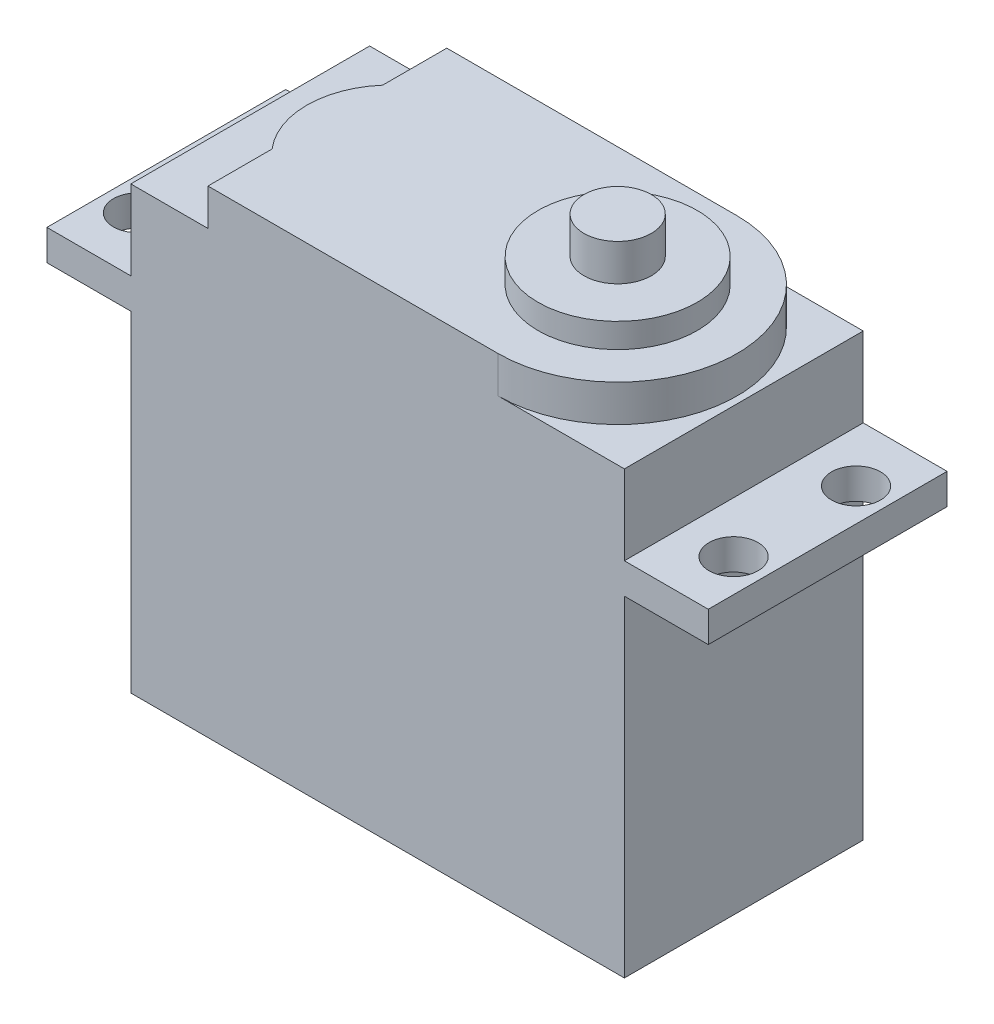
ISO-10303-21;
HEADER;
FILE_DESCRIPTION(('STEP AP214'),'2;1');
FILE_NAME('part.step','',(''),(''),'','','');
FILE_SCHEMA(('AUTOMOTIVE_DESIGN { 1 0 10303 214 1 1 1 1 }'));
ENDSEC;
DATA;
#1=APPLICATION_CONTEXT('core data for automotive mechanical design processes');
#2=APPLICATION_PROTOCOL_DEFINITION('international standard','automotive_design',2000,#1);
#3=PRODUCT_CONTEXT('',#1,'mechanical');
#4=PRODUCT('Part','Part','',(#3));
#5=PRODUCT_RELATED_PRODUCT_CATEGORY('part','',(#4));
#6=PRODUCT_DEFINITION_FORMATION('','',#4);
#7=PRODUCT_DEFINITION_CONTEXT('part definition',#1,'design');
#8=PRODUCT_DEFINITION('design','',#6,#7);
#9=PRODUCT_DEFINITION_SHAPE('','',#8);
#10=(LENGTH_UNIT() NAMED_UNIT(*) SI_UNIT(.MILLI.,.METRE.));
#11=(NAMED_UNIT(*) PLANE_ANGLE_UNIT() SI_UNIT($,.RADIAN.));
#12=(NAMED_UNIT(*) SI_UNIT($,.STERADIAN.) SOLID_ANGLE_UNIT());
#13=UNCERTAINTY_MEASURE_WITH_UNIT(LENGTH_MEASURE(1.E-05),#10,'distance_accuracy_value','');
#14=(GEOMETRIC_REPRESENTATION_CONTEXT(3) GLOBAL_UNCERTAINTY_ASSIGNED_CONTEXT((#13)) GLOBAL_UNIT_ASSIGNED_CONTEXT((#10,
#11,#12)) REPRESENTATION_CONTEXT('',''));
#15=CARTESIAN_POINT('',(0.,0.,0.));
#16=DIRECTION('',(0.,0.,1.));
#17=DIRECTION('',(1.,0.,0.));
#18=AXIS2_PLACEMENT_3D('',#15,#16,#17);
#19=CARTESIAN_POINT('',(0.,36.,0.));
#20=DIRECTION('',(0.,1.,0.));
#21=DIRECTION('',(0.,0.,1.));
#22=AXIS2_PLACEMENT_3D('',#19,#20,#21);
#23=PLANE('',#22);
#24=DIRECTION('',(0.,0.,1.));
#25=VECTOR('',#24,1.);
#26=CARTESIAN_POINT('',(-13.85,36.,9.75));
#27=LINE('',#26,#25);
#28=CARTESIAN_POINT('',(-13.85,36.,4.5109333321065));
#29=VERTEX_POINT('',#28);
#30=CARTESIAN_POINT('',(-13.85,36.,9.75));
#31=VERTEX_POINT('',#30);
#32=EDGE_CURVE('E193',#29,#31,#27,.T.);
#33=ORIENTED_EDGE('',*,*,#32,.F.);
#34=CARTESIAN_POINT('',(-8.63513234521918,36.,0.));
#35=DIRECTION('',(0.,1.,0.));
#36=DIRECTION('',(0.,0.,-1.));
#37=AXIS2_PLACEMENT_3D('',#34,#35,#36);
#38=CIRCLE('',#37,6.89516962689018);
#39=CARTESIAN_POINT('',(-13.85,36.,-4.51093333210651));
#40=VERTEX_POINT('',#39);
#41=EDGE_CURVE('E165',#40,#29,#38,.T.);
#42=ORIENTED_EDGE('',*,*,#41,.F.);
#43=CARTESIAN_POINT('',(-13.85,36.,-9.75));
#44=VERTEX_POINT('',#43);
#45=EDGE_CURVE('E174',#44,#40,#27,.T.);
#46=ORIENTED_EDGE('',*,*,#45,.F.);
#47=DIRECTION('',(-1.,0.,0.));
#48=VECTOR('',#47,1.);
#49=CARTESIAN_POINT('',(-20.15,36.,-9.75));
#50=LINE('',#49,#48);
#51=CARTESIAN_POINT('',(-20.15,36.,-9.75));
#52=VERTEX_POINT('',#51);
#53=EDGE_CURVE('E228',#44,#52,#50,.T.);
#54=ORIENTED_EDGE('',*,*,#53,.T.);
#55=DIRECTION('',(0.,0.,1.));
#56=VECTOR('',#55,1.);
#57=CARTESIAN_POINT('',(-20.15,36.,-9.75));
#58=LINE('',#57,#56);
#59=CARTESIAN_POINT('',(-20.15,36.,9.75));
#60=VERTEX_POINT('',#59);
#61=EDGE_CURVE('E232',#52,#60,#58,.T.);
#62=ORIENTED_EDGE('',*,*,#61,.T.);
#63=DIRECTION('',(1.,0.,0.));
#64=VECTOR('',#63,1.);
#65=CARTESIAN_POINT('',(-20.15,36.,9.75));
#66=LINE('',#65,#64);
#67=EDGE_CURVE('E235',#60,#31,#66,.T.);
#68=ORIENTED_EDGE('',*,*,#67,.T.);
#69=EDGE_LOOP('',(#33,#42,#46,#54,#62,#68));
#70=FACE_BOUND('',#69,.T.);
#71=ADVANCED_FACE('F33',(#70),#23,.T.);
#72=CARTESIAN_POINT('',(-13.85,39.,9.75));
#73=DIRECTION('',(1.,0.,0.));
#74=DIRECTION('',(0.,0.,-1.));
#75=AXIS2_PLACEMENT_3D('',#72,#73,#74);
#76=PLANE('',#75);
#77=DIRECTION('',(0.,-1.,0.));
#78=VECTOR('',#77,1.);
#79=CARTESIAN_POINT('',(-13.85,39.,4.5109333321065));
#80=LINE('',#79,#78);
#81=CARTESIAN_POINT('',(-13.85,39.,4.5109333321065));
#82=VERTEX_POINT('',#81);
#83=EDGE_CURVE('E50',#82,#29,#80,.T.);
#84=ORIENTED_EDGE('',*,*,#83,.T.);
#85=ORIENTED_EDGE('',*,*,#32,.T.);
#86=DIRECTION('',(0.,-1.,0.));
#87=VECTOR('',#86,1.);
#88=CARTESIAN_POINT('',(-13.85,39.,9.75));
#89=LINE('',#88,#87);
#90=CARTESIAN_POINT('',(-13.85,39.,9.75));
#91=VERTEX_POINT('',#90);
#92=EDGE_CURVE('E202',#91,#31,#89,.T.);
#93=ORIENTED_EDGE('',*,*,#92,.F.);
#94=DIRECTION('',(0.,0.,1.));
#95=VECTOR('',#94,1.);
#96=CARTESIAN_POINT('',(-13.85,39.,9.75));
#97=LINE('',#96,#95);
#98=EDGE_CURVE('E181',#82,#91,#97,.T.);
#99=ORIENTED_EDGE('',*,*,#98,.F.);
#100=EDGE_LOOP('',(#84,#85,#93,#99));
#101=FACE_BOUND('',#100,.T.);
#102=ADVANCED_FACE('F341',(#101),#76,.F.);
#103=DIRECTION('',(0.,-1.,0.));
#104=VECTOR('',#103,1.);
#105=CARTESIAN_POINT('',(-13.85,39.,-4.51093333210651));
#106=LINE('',#105,#104);
#107=CARTESIAN_POINT('',(-13.85,39.,-4.51093333210651));
#108=VERTEX_POINT('',#107);
#109=EDGE_CURVE('E160',#108,#40,#106,.T.);
#110=ORIENTED_EDGE('',*,*,#109,.F.);
#111=CARTESIAN_POINT('',(-13.85,39.,-9.75));
#112=VERTEX_POINT('',#111);
#113=EDGE_CURVE('E172',#112,#108,#97,.T.);
#114=ORIENTED_EDGE('',*,*,#113,.F.);
#115=DIRECTION('',(0.,-1.,0.));
#116=VECTOR('',#115,1.);
#117=CARTESIAN_POINT('',(-13.85,39.,-9.75));
#118=LINE('',#117,#116);
#119=EDGE_CURVE('E191',#112,#44,#118,.T.);
#120=ORIENTED_EDGE('',*,*,#119,.T.);
#121=ORIENTED_EDGE('',*,*,#45,.T.);
#122=EDGE_LOOP('',(#110,#114,#120,#121));
#123=FACE_BOUND('',#122,.T.);
#124=ADVANCED_FACE('F170',(#123),#76,.F.);
#125=CARTESIAN_POINT('',(20.15,36.,-9.75));
#126=VERTEX_POINT('',#125);
#127=CARTESIAN_POINT('',(9.85,36.,-9.75));
#128=VERTEX_POINT('',#127);
#129=EDGE_CURVE('E230',#126,#128,#50,.T.);
#130=ORIENTED_EDGE('',*,*,#129,.T.);
#131=CARTESIAN_POINT('',(9.85,36.,0.));
#132=DIRECTION('',(0.,1.,0.));
#133=DIRECTION('',(0.,0.,1.));
#134=AXIS2_PLACEMENT_3D('',#131,#132,#133);
#135=CIRCLE('',#134,9.75);
#136=CARTESIAN_POINT('',(9.85,36.,9.75));
#137=VERTEX_POINT('',#136);
#138=EDGE_CURVE('E58',#137,#128,#135,.T.);
#139=ORIENTED_EDGE('',*,*,#138,.F.);
#140=CARTESIAN_POINT('',(20.15,36.,9.75));
#141=VERTEX_POINT('',#140);
#142=EDGE_CURVE('E234',#137,#141,#66,.T.);
#143=ORIENTED_EDGE('',*,*,#142,.T.);
#144=DIRECTION('',(0.,0.,-1.));
#145=VECTOR('',#144,1.);
#146=CARTESIAN_POINT('',(20.15,36.,-9.75));
#147=LINE('',#146,#145);
#148=EDGE_CURVE('E225',#141,#126,#147,.T.);
#149=ORIENTED_EDGE('',*,*,#148,.T.);
#150=EDGE_LOOP('',(#130,#139,#143,#149));
#151=FACE_BOUND('',#150,.T.);
#152=ADVANCED_FACE('F344',(#151),#23,.T.);
#153=CARTESIAN_POINT('',(0.,29.5,0.));
#154=DIRECTION('',(0.,1.,0.));
#155=DIRECTION('',(0.,0.,1.));
#156=AXIS2_PLACEMENT_3D('',#153,#154,#155);
#157=PLANE('',#156);
#158=CARTESIAN_POINT('',(24.315,29.5,5.));
#159=DIRECTION('',(0.,1.,0.));
#160=DIRECTION('',(0.,0.,1.));
#161=AXIS2_PLACEMENT_3D('',#158,#159,#160);
#162=CIRCLE('',#161,2.);
#163=CARTESIAN_POINT('',(24.315,29.5,7.00000000000001));
#164=VERTEX_POINT('',#163);
#165=EDGE_CURVE('E214',#164,#164,#162,.T.);
#166=ORIENTED_EDGE('',*,*,#165,.F.);
#167=EDGE_LOOP('',(#166));
#168=FACE_BOUND('',#167,.T.);
#169=CARTESIAN_POINT('',(24.315,29.5,-5.));
#170=DIRECTION('',(0.,1.,0.));
#171=DIRECTION('',(0.,0.,1.));
#172=AXIS2_PLACEMENT_3D('',#169,#170,#171);
#173=CIRCLE('',#172,2.);
#174=CARTESIAN_POINT('',(24.315,29.5,-3.));
#175=VERTEX_POINT('',#174);
#176=EDGE_CURVE('E210',#175,#175,#173,.T.);
#177=ORIENTED_EDGE('',*,*,#176,.F.);
#178=EDGE_LOOP('',(#177));
#179=FACE_BOUND('',#178,.T.);
#180=DIRECTION('',(0.,0.,-1.));
#181=VECTOR('',#180,1.);
#182=CARTESIAN_POINT('',(20.15,29.5,-9.75));
#183=LINE('',#182,#181);
#184=CARTESIAN_POINT('',(20.15,29.5,9.75));
#185=VERTEX_POINT('',#184);
#186=CARTESIAN_POINT('',(20.15,29.5,-9.75));
#187=VERTEX_POINT('',#186);
#188=EDGE_CURVE('E224',#185,#187,#183,.T.);
#189=ORIENTED_EDGE('',*,*,#188,.F.);
#190=DIRECTION('',(1.,0.,0.));
#191=VECTOR('',#190,1.);
#192=CARTESIAN_POINT('',(-27.,29.5,9.75));
#193=LINE('',#192,#191);
#194=CARTESIAN_POINT('',(27.,29.5,9.75));
#195=VERTEX_POINT('',#194);
#196=EDGE_CURVE('E264',#185,#195,#193,.T.);
#197=ORIENTED_EDGE('',*,*,#196,.T.);
#198=DIRECTION('',(0.,0.,-1.));
#199=VECTOR('',#198,1.);
#200=CARTESIAN_POINT('',(27.,29.5,-9.75));
#201=LINE('',#200,#199);
#202=CARTESIAN_POINT('',(27.,29.5,-9.75));
#203=VERTEX_POINT('',#202);
#204=EDGE_CURVE('E255',#195,#203,#201,.T.);
#205=ORIENTED_EDGE('',*,*,#204,.T.);
#206=DIRECTION('',(-1.,0.,0.));
#207=VECTOR('',#206,1.);
#208=CARTESIAN_POINT('',(-27.,29.5,-9.75));
#209=LINE('',#208,#207);
#210=EDGE_CURVE('E260',#203,#187,#209,.T.);
#211=ORIENTED_EDGE('',*,*,#210,.T.);
#212=EDGE_LOOP('',(#189,#197,#205,#211));
#213=FACE_BOUND('',#212,.T.);
#214=ADVANCED_FACE('F354',(#168,#179,#213),#157,.T.);
#215=CARTESIAN_POINT('',(20.15,27.,-9.75000000000001));
#216=DIRECTION('',(-1.,0.,0.));
#217=DIRECTION('',(0.,0.,1.));
#218=AXIS2_PLACEMENT_3D('',#215,#216,#217);
#219=PLANE('',#218);
#220=DIRECTION('',(0.,0.,-1.));
#221=VECTOR('',#220,1.);
#222=CARTESIAN_POINT('',(20.15,0.,-9.75000000000001));
#223=LINE('',#222,#221);
#224=CARTESIAN_POINT('',(20.15,0.,9.74999999999999));
#225=VERTEX_POINT('',#224);
#226=CARTESIAN_POINT('',(20.15,0.,-9.75000000000001));
#227=VERTEX_POINT('',#226);
#228=EDGE_CURVE('E290',#225,#227,#223,.T.);
#229=ORIENTED_EDGE('',*,*,#228,.T.);
#230=DIRECTION('',(0.,-1.,0.));
#231=VECTOR('',#230,1.);
#232=CARTESIAN_POINT('',(20.15,27.,-9.75000000000001));
#233=LINE('',#232,#231);
#234=CARTESIAN_POINT('',(20.15,27.,-9.75000000000001));
#235=VERTEX_POINT('',#234);
#236=EDGE_CURVE('E11',#235,#227,#233,.T.);
#237=ORIENTED_EDGE('',*,*,#236,.F.);
#238=DIRECTION('',(0.,0.,-1.));
#239=VECTOR('',#238,1.);
#240=CARTESIAN_POINT('',(20.15,27.,-9.75000000000001));
#241=LINE('',#240,#239);
#242=CARTESIAN_POINT('',(20.15,27.,9.74999999999999));
#243=VERTEX_POINT('',#242);
#244=EDGE_CURVE('E291',#243,#235,#241,.T.);
#245=ORIENTED_EDGE('',*,*,#244,.F.);
#246=DIRECTION('',(0.,-1.,0.));
#247=VECTOR('',#246,1.);
#248=CARTESIAN_POINT('',(20.15,27.,9.74999999999999));
#249=LINE('',#248,#247);
#250=EDGE_CURVE('E298',#243,#225,#249,.T.);
#251=ORIENTED_EDGE('',*,*,#250,.T.);
#252=EDGE_LOOP('',(#229,#237,#245,#251));
#253=FACE_BOUND('',#252,.T.);
#254=ADVANCED_FACE('F35',(#253),#219,.F.);
#255=CARTESIAN_POINT('',(-20.15,27.,-9.75));
#256=DIRECTION('',(0.,0.,1.));
#257=DIRECTION('',(1.,0.,0.));
#258=AXIS2_PLACEMENT_3D('',#255,#256,#257);
#259=PLANE('',#258);
#260=DIRECTION('',(-1.,0.,0.));
#261=VECTOR('',#260,1.);
#262=CARTESIAN_POINT('',(-20.15,0.,-9.75));
#263=LINE('',#262,#261);
#264=CARTESIAN_POINT('',(-20.15,0.,-9.75));
#265=VERTEX_POINT('',#264);
#266=EDGE_CURVE('E301',#227,#265,#263,.T.);
#267=ORIENTED_EDGE('',*,*,#266,.T.);
#268=DIRECTION('',(0.,-1.,0.));
#269=VECTOR('',#268,1.);
#270=CARTESIAN_POINT('',(-20.15,27.,-9.75));
#271=LINE('',#270,#269);
#272=CARTESIAN_POINT('',(-20.15,27.,-9.75));
#273=VERTEX_POINT('',#272);
#274=EDGE_CURVE('E42',#273,#265,#271,.T.);
#275=ORIENTED_EDGE('',*,*,#274,.F.);
#276=DIRECTION('',(-1.,0.,0.));
#277=VECTOR('',#276,1.);
#278=CARTESIAN_POINT('',(-27.,27.,-9.75));
#279=LINE('',#278,#277);
#280=CARTESIAN_POINT('',(-27.,27.,-9.75));
#281=VERTEX_POINT('',#280);
#282=EDGE_CURVE('E270',#273,#281,#279,.T.);
#283=ORIENTED_EDGE('',*,*,#282,.T.);
#284=DIRECTION('',(0.,-1.,0.));
#285=VECTOR('',#284,1.);
#286=CARTESIAN_POINT('',(-27.,29.5,-9.75));
#287=LINE('',#286,#285);
#288=CARTESIAN_POINT('',(-27.,29.5,-9.75));
#289=VERTEX_POINT('',#288);
#290=EDGE_CURVE('E284',#289,#281,#287,.T.);
#291=ORIENTED_EDGE('',*,*,#290,.F.);
#292=CARTESIAN_POINT('',(-20.15,29.5,-9.75));
#293=VERTEX_POINT('',#292);
#294=EDGE_CURVE('E258',#293,#289,#209,.T.);
#295=ORIENTED_EDGE('',*,*,#294,.F.);
#296=DIRECTION('',(0.,-1.,0.));
#297=VECTOR('',#296,1.);
#298=CARTESIAN_POINT('',(-20.15,36.,-9.75));
#299=LINE('',#298,#297);
#300=EDGE_CURVE('E248',#52,#293,#299,.T.);
#301=ORIENTED_EDGE('',*,*,#300,.F.);
#302=ORIENTED_EDGE('',*,*,#53,.F.);
#303=ORIENTED_EDGE('',*,*,#119,.F.);
#304=DIRECTION('',(-1.,0.,0.));
#305=VECTOR('',#304,1.);
#306=CARTESIAN_POINT('',(9.85,39.,-9.75));
#307=LINE('',#306,#305);
#308=CARTESIAN_POINT('',(9.85,39.,-9.75));
#309=VERTEX_POINT('',#308);
#310=EDGE_CURVE('E178',#309,#112,#307,.T.);
#311=ORIENTED_EDGE('',*,*,#310,.F.);
#312=DIRECTION('',(0.,-1.,0.));
#313=VECTOR('',#312,1.);
#314=CARTESIAN_POINT('',(9.85,39.,-9.75));
#315=LINE('',#314,#313);
#316=EDGE_CURVE('E196',#309,#128,#315,.T.);
#317=ORIENTED_EDGE('',*,*,#316,.T.);
#318=ORIENTED_EDGE('',*,*,#129,.F.);
#319=DIRECTION('',(0.,-1.,0.));
#320=VECTOR('',#319,1.);
#321=CARTESIAN_POINT('',(20.15,36.,-9.75));
#322=LINE('',#321,#320);
#323=EDGE_CURVE('E251',#126,#187,#322,.T.);
#324=ORIENTED_EDGE('',*,*,#323,.T.);
#325=ORIENTED_EDGE('',*,*,#210,.F.);
#326=DIRECTION('',(0.,-1.,0.));
#327=VECTOR('',#326,1.);
#328=CARTESIAN_POINT('',(27.,29.5,-9.75));
#329=LINE('',#328,#327);
#330=CARTESIAN_POINT('',(27.,27.,-9.75));
#331=VERTEX_POINT('',#330);
#332=EDGE_CURVE('E287',#203,#331,#329,.T.);
#333=ORIENTED_EDGE('',*,*,#332,.T.);
#334=EDGE_CURVE('E271',#331,#235,#279,.T.);
#335=ORIENTED_EDGE('',*,*,#334,.T.);
#336=ORIENTED_EDGE('',*,*,#236,.T.);
#337=EDGE_LOOP('',(#267,#275,#283,#291,#295,#301,#302,#303,#311,#317,#318,#324,#325,#333,#335,#336));
#338=FACE_BOUND('',#337,.T.);
#339=ADVANCED_FACE('F368',(#338),#259,.F.);
#340=CARTESIAN_POINT('',(-20.15,27.,-9.75));
#341=DIRECTION('',(1.,0.,0.));
#342=DIRECTION('',(0.,0.,-1.));
#343=AXIS2_PLACEMENT_3D('',#340,#341,#342);
#344=PLANE('',#343);
#345=DIRECTION('',(0.,0.,1.));
#346=VECTOR('',#345,1.);
#347=CARTESIAN_POINT('',(-20.15,0.,-9.75));
#348=LINE('',#347,#346);
#349=CARTESIAN_POINT('',(-20.15,0.,9.74999999999999));
#350=VERTEX_POINT('',#349);
#351=EDGE_CURVE('E303',#265,#350,#348,.T.);
#352=ORIENTED_EDGE('',*,*,#351,.T.);
#353=DIRECTION('',(0.,-1.,0.));
#354=VECTOR('',#353,1.);
#355=CARTESIAN_POINT('',(-20.15,27.,9.74999999999999));
#356=LINE('',#355,#354);
#357=CARTESIAN_POINT('',(-20.15,27.,9.75));
#358=VERTEX_POINT('',#357);
#359=EDGE_CURVE('E308',#358,#350,#356,.T.);
#360=ORIENTED_EDGE('',*,*,#359,.F.);
#361=DIRECTION('',(0.,0.,1.));
#362=VECTOR('',#361,1.);
#363=CARTESIAN_POINT('',(-20.15,27.,-9.75));
#364=LINE('',#363,#362);
#365=EDGE_CURVE('E294',#273,#358,#364,.T.);
#366=ORIENTED_EDGE('',*,*,#365,.F.);
#367=ORIENTED_EDGE('',*,*,#274,.T.);
#368=EDGE_LOOP('',(#352,#360,#366,#367));
#369=FACE_BOUND('',#368,.T.);
#370=ADVANCED_FACE('F451',(#369),#344,.F.);
#371=CARTESIAN_POINT('',(-20.15,27.,9.74999999999999));
#372=DIRECTION('',(0.,0.,-1.));
#373=DIRECTION('',(-1.,0.,0.));
#374=AXIS2_PLACEMENT_3D('',#371,#372,#373);
#375=PLANE('',#374);
#376=DIRECTION('',(1.,0.,0.));
#377=VECTOR('',#376,1.);
#378=CARTESIAN_POINT('',(-20.15,0.,9.74999999999999));
#379=LINE('',#378,#377);
#380=EDGE_CURVE('E295',#350,#225,#379,.T.);
#381=ORIENTED_EDGE('',*,*,#380,.T.);
#382=ORIENTED_EDGE('',*,*,#250,.F.);
#383=DIRECTION('',(1.,0.,0.));
#384=VECTOR('',#383,1.);
#385=CARTESIAN_POINT('',(-27.,27.,9.75));
#386=LINE('',#385,#384);
#387=CARTESIAN_POINT('',(27.,27.,9.75));
#388=VERTEX_POINT('',#387);
#389=EDGE_CURVE('E276',#243,#388,#386,.T.);
#390=ORIENTED_EDGE('',*,*,#389,.T.);
#391=DIRECTION('',(0.,-1.,0.));
#392=VECTOR('',#391,1.);
#393=CARTESIAN_POINT('',(27.,29.5,9.75));
#394=LINE('',#393,#392);
#395=EDGE_CURVE('E267',#195,#388,#394,.T.);
#396=ORIENTED_EDGE('',*,*,#395,.F.);
#397=ORIENTED_EDGE('',*,*,#196,.F.);
#398=DIRECTION('',(0.,-1.,0.));
#399=VECTOR('',#398,1.);
#400=CARTESIAN_POINT('',(20.15,36.,9.75));
#401=LINE('',#400,#399);
#402=EDGE_CURVE('E238',#141,#185,#401,.T.);
#403=ORIENTED_EDGE('',*,*,#402,.F.);
#404=ORIENTED_EDGE('',*,*,#142,.F.);
#405=DIRECTION('',(0.,-1.,0.));
#406=VECTOR('',#405,1.);
#407=CARTESIAN_POINT('',(9.85,39.,9.75));
#408=LINE('',#407,#406);
#409=CARTESIAN_POINT('',(9.85,39.,9.75));
#410=VERTEX_POINT('',#409);
#411=EDGE_CURVE('E199',#410,#137,#408,.T.);
#412=ORIENTED_EDGE('',*,*,#411,.F.);
#413=DIRECTION('',(1.,0.,0.));
#414=VECTOR('',#413,1.);
#415=CARTESIAN_POINT('',(9.85,39.,9.75));
#416=LINE('',#415,#414);
#417=EDGE_CURVE('E180',#91,#410,#416,.T.);
#418=ORIENTED_EDGE('',*,*,#417,.F.);
#419=ORIENTED_EDGE('',*,*,#92,.T.);
#420=ORIENTED_EDGE('',*,*,#67,.F.);
#421=DIRECTION('',(0.,-1.,0.));
#422=VECTOR('',#421,1.);
#423=CARTESIAN_POINT('',(-20.15,36.,9.75));
#424=LINE('',#423,#422);
#425=CARTESIAN_POINT('',(-20.15,29.5,9.75));
#426=VERTEX_POINT('',#425);
#427=EDGE_CURVE('E245',#60,#426,#424,.T.);
#428=ORIENTED_EDGE('',*,*,#427,.T.);
#429=CARTESIAN_POINT('',(-27.,29.5,9.75));
#430=VERTEX_POINT('',#429);
#431=EDGE_CURVE('E265',#430,#426,#193,.T.);
#432=ORIENTED_EDGE('',*,*,#431,.F.);
#433=DIRECTION('',(0.,-1.,0.));
#434=VECTOR('',#433,1.);
#435=CARTESIAN_POINT('',(-27.,29.5,9.75));
#436=LINE('',#435,#434);
#437=CARTESIAN_POINT('',(-27.,27.,9.75));
#438=VERTEX_POINT('',#437);
#439=EDGE_CURVE('E281',#430,#438,#436,.T.);
#440=ORIENTED_EDGE('',*,*,#439,.T.);
#441=EDGE_CURVE('E259',#438,#358,#386,.T.);
#442=ORIENTED_EDGE('',*,*,#441,.T.);
#443=ORIENTED_EDGE('',*,*,#359,.T.);
#444=EDGE_LOOP('',(#381,#382,#390,#396,#397,#403,#404,#412,#418,#419,#420,#428,#432,#440,#442,#443));
#445=FACE_BOUND('',#444,.T.);
#446=ADVANCED_FACE('F430',(#445),#375,.F.);
#447=CARTESIAN_POINT('',(0.,0.,0.));
#448=DIRECTION('',(0.,1.,0.));
#449=DIRECTION('',(0.,0.,1.));
#450=AXIS2_PLACEMENT_3D('',#447,#448,#449);
#451=PLANE('',#450);
#452=ORIENTED_EDGE('',*,*,#228,.F.);
#453=ORIENTED_EDGE('',*,*,#380,.F.);
#454=ORIENTED_EDGE('',*,*,#351,.F.);
#455=ORIENTED_EDGE('',*,*,#266,.F.);
#456=EDGE_LOOP('',(#452,#453,#454,#455));
#457=FACE_BOUND('',#456,.T.);
#458=ADVANCED_FACE('F448',(#457),#451,.F.);
#459=CARTESIAN_POINT('',(0.,27.,0.));
#460=DIRECTION('',(0.,1.,0.));
#461=DIRECTION('',(0.,0.,1.));
#462=AXIS2_PLACEMENT_3D('',#459,#460,#461);
#463=PLANE('',#462);
#464=CARTESIAN_POINT('',(24.315,27.,5.));
#465=DIRECTION('',(0.,1.,0.));
#466=DIRECTION('',(0.,0.,1.));
#467=AXIS2_PLACEMENT_3D('',#464,#465,#466);
#468=CIRCLE('',#467,2.);
#469=CARTESIAN_POINT('',(24.315,27.,7.00000000000001));
#470=VERTEX_POINT('',#469);
#471=EDGE_CURVE('E213',#470,#470,#468,.T.);
#472=ORIENTED_EDGE('',*,*,#471,.T.);
#473=EDGE_LOOP('',(#472));
#474=FACE_BOUND('',#473,.T.);
#475=CARTESIAN_POINT('',(24.315,27.,-5.));
#476=DIRECTION('',(0.,1.,0.));
#477=DIRECTION('',(0.,0.,1.));
#478=AXIS2_PLACEMENT_3D('',#475,#476,#477);
#479=CIRCLE('',#478,2.);
#480=CARTESIAN_POINT('',(24.315,27.,-3.));
#481=VERTEX_POINT('',#480);
#482=EDGE_CURVE('E209',#481,#481,#479,.T.);
#483=ORIENTED_EDGE('',*,*,#482,.T.);
#484=EDGE_LOOP('',(#483));
#485=FACE_BOUND('',#484,.T.);
#486=ORIENTED_EDGE('',*,*,#389,.F.);
#487=ORIENTED_EDGE('',*,*,#244,.T.);
#488=ORIENTED_EDGE('',*,*,#334,.F.);
#489=DIRECTION('',(0.,0.,-1.));
#490=VECTOR('',#489,1.);
#491=CARTESIAN_POINT('',(27.,27.,-9.75));
#492=LINE('',#491,#490);
#493=EDGE_CURVE('E254',#388,#331,#492,.T.);
#494=ORIENTED_EDGE('',*,*,#493,.F.);
#495=EDGE_LOOP('',(#486,#487,#488,#494));
#496=FACE_BOUND('',#495,.T.);
#497=ADVANCED_FACE('F321',(#474,#485,#496),#463,.F.);
#498=CARTESIAN_POINT('',(-24.315,27.,5.));
#499=DIRECTION('',(0.,1.,0.));
#500=DIRECTION('',(0.,0.,1.));
#501=AXIS2_PLACEMENT_3D('',#498,#499,#500);
#502=CIRCLE('',#501,2.);
#503=CARTESIAN_POINT('',(-24.315,27.,7.00000000000001));
#504=VERTEX_POINT('',#503);
#505=EDGE_CURVE('E206',#504,#504,#502,.T.);
#506=ORIENTED_EDGE('',*,*,#505,.T.);
#507=EDGE_LOOP('',(#506));
#508=FACE_BOUND('',#507,.T.);
#509=CARTESIAN_POINT('',(-24.315,27.,-5.));
#510=DIRECTION('',(0.,1.,0.));
#511=DIRECTION('',(0.,0.,1.));
#512=AXIS2_PLACEMENT_3D('',#509,#510,#511);
#513=CIRCLE('',#512,2.);
#514=CARTESIAN_POINT('',(-24.315,27.,-3.));
#515=VERTEX_POINT('',#514);
#516=EDGE_CURVE('E218',#515,#515,#513,.T.);
#517=ORIENTED_EDGE('',*,*,#516,.T.);
#518=EDGE_LOOP('',(#517));
#519=FACE_BOUND('',#518,.T.);
#520=ORIENTED_EDGE('',*,*,#282,.F.);
#521=ORIENTED_EDGE('',*,*,#365,.T.);
#522=ORIENTED_EDGE('',*,*,#441,.F.);
#523=DIRECTION('',(0.,0.,1.));
#524=VECTOR('',#523,1.);
#525=CARTESIAN_POINT('',(-27.,27.,-9.75));
#526=LINE('',#525,#524);
#527=EDGE_CURVE('E274',#281,#438,#526,.T.);
#528=ORIENTED_EDGE('',*,*,#527,.F.);
#529=EDGE_LOOP('',(#520,#521,#522,#528));
#530=FACE_BOUND('',#529,.T.);
#531=ADVANCED_FACE('F406',(#508,#519,#530),#463,.F.);
#532=CARTESIAN_POINT('',(27.,29.5,-9.75));
#533=DIRECTION('',(-1.,0.,0.));
#534=DIRECTION('',(0.,0.,1.));
#535=AXIS2_PLACEMENT_3D('',#532,#533,#534);
#536=PLANE('',#535);
#537=ORIENTED_EDGE('',*,*,#493,.T.);
#538=ORIENTED_EDGE('',*,*,#332,.F.);
#539=ORIENTED_EDGE('',*,*,#204,.F.);
#540=ORIENTED_EDGE('',*,*,#395,.T.);
#541=EDGE_LOOP('',(#537,#538,#539,#540));
#542=FACE_BOUND('',#541,.T.);
#543=ADVANCED_FACE('F409',(#542),#536,.F.);
#544=CARTESIAN_POINT('',(-27.,29.5,-9.75));
#545=DIRECTION('',(1.,0.,0.));
#546=DIRECTION('',(0.,0.,-1.));
#547=AXIS2_PLACEMENT_3D('',#544,#545,#546);
#548=PLANE('',#547);
#549=ORIENTED_EDGE('',*,*,#527,.T.);
#550=ORIENTED_EDGE('',*,*,#439,.F.);
#551=DIRECTION('',(0.,0.,1.));
#552=VECTOR('',#551,1.);
#553=CARTESIAN_POINT('',(-27.,29.5,-9.75));
#554=LINE('',#553,#552);
#555=EDGE_CURVE('E262',#289,#430,#554,.T.);
#556=ORIENTED_EDGE('',*,*,#555,.F.);
#557=ORIENTED_EDGE('',*,*,#290,.T.);
#558=EDGE_LOOP('',(#549,#550,#556,#557));
#559=FACE_BOUND('',#558,.T.);
#560=ADVANCED_FACE('F420',(#559),#548,.F.);
#561=CARTESIAN_POINT('',(-24.315,29.5,5.));
#562=DIRECTION('',(0.,1.,0.));
#563=DIRECTION('',(0.,0.,1.));
#564=AXIS2_PLACEMENT_3D('',#561,#562,#563);
#565=CIRCLE('',#564,2.);
#566=CARTESIAN_POINT('',(-24.315,29.5,7.00000000000001));
#567=VERTEX_POINT('',#566);
#568=EDGE_CURVE('E205',#567,#567,#565,.T.);
#569=ORIENTED_EDGE('',*,*,#568,.F.);
#570=EDGE_LOOP('',(#569));
#571=FACE_BOUND('',#570,.T.);
#572=CARTESIAN_POINT('',(-24.315,29.5,-5.));
#573=DIRECTION('',(0.,1.,0.));
#574=DIRECTION('',(0.,0.,1.));
#575=AXIS2_PLACEMENT_3D('',#572,#573,#574);
#576=CIRCLE('',#575,2.);
#577=CARTESIAN_POINT('',(-24.315,29.5,-3.));
#578=VERTEX_POINT('',#577);
#579=EDGE_CURVE('E217',#578,#578,#576,.T.);
#580=ORIENTED_EDGE('',*,*,#579,.F.);
#581=EDGE_LOOP('',(#580));
#582=FACE_BOUND('',#581,.T.);
#583=DIRECTION('',(0.,0.,1.));
#584=VECTOR('',#583,1.);
#585=CARTESIAN_POINT('',(-20.15,29.5,-9.75));
#586=LINE('',#585,#584);
#587=EDGE_CURVE('E229',#293,#426,#586,.T.);
#588=ORIENTED_EDGE('',*,*,#587,.F.);
#589=ORIENTED_EDGE('',*,*,#294,.T.);
#590=ORIENTED_EDGE('',*,*,#555,.T.);
#591=ORIENTED_EDGE('',*,*,#431,.T.);
#592=EDGE_LOOP('',(#588,#589,#590,#591));
#593=FACE_BOUND('',#592,.T.);
#594=ADVANCED_FACE('F361',(#571,#582,#593),#157,.T.);
#595=CARTESIAN_POINT('',(20.15,36.,-9.75));
#596=DIRECTION('',(-1.,0.,0.));
#597=DIRECTION('',(0.,0.,1.));
#598=AXIS2_PLACEMENT_3D('',#595,#596,#597);
#599=PLANE('',#598);
#600=ORIENTED_EDGE('',*,*,#188,.T.);
#601=ORIENTED_EDGE('',*,*,#323,.F.);
#602=ORIENTED_EDGE('',*,*,#148,.F.);
#603=ORIENTED_EDGE('',*,*,#402,.T.);
#604=EDGE_LOOP('',(#600,#601,#602,#603));
#605=FACE_BOUND('',#604,.T.);
#606=ADVANCED_FACE('F435',(#605),#599,.F.);
#607=CARTESIAN_POINT('',(-20.15,36.,-9.75));
#608=DIRECTION('',(1.,0.,0.));
#609=DIRECTION('',(0.,0.,-1.));
#610=AXIS2_PLACEMENT_3D('',#607,#608,#609);
#611=PLANE('',#610);
#612=ORIENTED_EDGE('',*,*,#587,.T.);
#613=ORIENTED_EDGE('',*,*,#427,.F.);
#614=ORIENTED_EDGE('',*,*,#61,.F.);
#615=ORIENTED_EDGE('',*,*,#300,.T.);
#616=EDGE_LOOP('',(#612,#613,#614,#615));
#617=FACE_BOUND('',#616,.T.);
#618=ADVANCED_FACE('F399',(#617),#611,.F.);
#619=CARTESIAN_POINT('',(-24.315,0.,-5.));
#620=DIRECTION('',(0.,1.,0.));
#621=DIRECTION('',(0.,0.,1.));
#622=AXIS2_PLACEMENT_3D('',#619,#620,#621);
#623=CYLINDRICAL_SURFACE('',#622,2.);
#624=ORIENTED_EDGE('',*,*,#579,.T.);
#625=EDGE_LOOP('',(#624));
#626=FACE_BOUND('',#625,.T.);
#627=ORIENTED_EDGE('',*,*,#516,.F.);
#628=EDGE_LOOP('',(#627));
#629=FACE_BOUND('',#628,.T.);
#630=ADVANCED_FACE('F394',(#626,#629),#623,.F.);
#631=CARTESIAN_POINT('',(-24.315,0.,5.));
#632=DIRECTION('',(0.,1.,0.));
#633=DIRECTION('',(0.,0.,1.));
#634=AXIS2_PLACEMENT_3D('',#631,#632,#633);
#635=CYLINDRICAL_SURFACE('',#634,2.);
#636=ORIENTED_EDGE('',*,*,#568,.T.);
#637=EDGE_LOOP('',(#636));
#638=FACE_BOUND('',#637,.T.);
#639=ORIENTED_EDGE('',*,*,#505,.F.);
#640=EDGE_LOOP('',(#639));
#641=FACE_BOUND('',#640,.T.);
#642=ADVANCED_FACE('F336',(#638,#641),#635,.F.);
#643=CARTESIAN_POINT('',(24.315,0.,-5.));
#644=DIRECTION('',(0.,1.,0.));
#645=DIRECTION('',(0.,0.,1.));
#646=AXIS2_PLACEMENT_3D('',#643,#644,#645);
#647=CYLINDRICAL_SURFACE('',#646,2.);
#648=ORIENTED_EDGE('',*,*,#176,.T.);
#649=EDGE_LOOP('',(#648));
#650=FACE_BOUND('',#649,.T.);
#651=ORIENTED_EDGE('',*,*,#482,.F.);
#652=EDGE_LOOP('',(#651));
#653=FACE_BOUND('',#652,.T.);
#654=ADVANCED_FACE('F327',(#650,#653),#647,.F.);
#655=CARTESIAN_POINT('',(24.315,0.,5.));
#656=DIRECTION('',(0.,1.,0.));
#657=DIRECTION('',(0.,0.,1.));
#658=AXIS2_PLACEMENT_3D('',#655,#656,#657);
#659=CYLINDRICAL_SURFACE('',#658,2.);
#660=ORIENTED_EDGE('',*,*,#165,.T.);
#661=EDGE_LOOP('',(#660));
#662=FACE_BOUND('',#661,.T.);
#663=ORIENTED_EDGE('',*,*,#471,.F.);
#664=EDGE_LOOP('',(#663));
#665=FACE_BOUND('',#664,.T.);
#666=ADVANCED_FACE('F324',(#662,#665),#659,.F.);
#667=CARTESIAN_POINT('',(9.85,39.,0.));
#668=DIRECTION('',(0.,-1.,0.));
#669=DIRECTION('',(0.,0.,-1.));
#670=AXIS2_PLACEMENT_3D('',#667,#668,#669);
#671=CYLINDRICAL_SURFACE('',#670,9.75);
#672=ORIENTED_EDGE('',*,*,#138,.T.);
#673=ORIENTED_EDGE('',*,*,#316,.F.);
#674=CARTESIAN_POINT('',(9.85,39.,0.));
#675=DIRECTION('',(0.,1.,0.));
#676=DIRECTION('',(0.,0.,1.));
#677=AXIS2_PLACEMENT_3D('',#674,#675,#676);
#678=CIRCLE('',#677,9.75);
#679=EDGE_CURVE('E183',#410,#309,#678,.T.);
#680=ORIENTED_EDGE('',*,*,#679,.F.);
#681=ORIENTED_EDGE('',*,*,#411,.T.);
#682=EDGE_LOOP('',(#672,#673,#680,#681));
#683=FACE_BOUND('',#682,.T.);
#684=ADVANCED_FACE('F326',(#683),#671,.T.);
#685=CARTESIAN_POINT('',(9.85,39.,0.));
#686=DIRECTION('',(0.,1.,0.));
#687=DIRECTION('',(0.,0.,1.));
#688=AXIS2_PLACEMENT_3D('',#685,#686,#687);
#689=PLANE('',#688);
#690=CARTESIAN_POINT('',(9.85,39.,0.));
#691=DIRECTION('',(0.,1.,0.));
#692=DIRECTION('',(0.,0.,1.));
#693=AXIS2_PLACEMENT_3D('',#690,#691,#692);
#694=CIRCLE('',#693,6.5);
#695=CARTESIAN_POINT('',(9.85,39.,6.5));
#696=VERTEX_POINT('',#695);
#697=EDGE_CURVE('E186',#696,#696,#694,.T.);
#698=ORIENTED_EDGE('',*,*,#697,.F.);
#699=EDGE_LOOP('',(#698));
#700=FACE_BOUND('',#699,.T.);
#701=ORIENTED_EDGE('',*,*,#113,.T.);
#702=CARTESIAN_POINT('',(-8.63513234521918,39.,0.));
#703=DIRECTION('',(0.,1.,0.));
#704=DIRECTION('',(0.,0.,-1.));
#705=AXIS2_PLACEMENT_3D('',#702,#703,#704);
#706=CIRCLE('',#705,6.89516962689018);
#707=EDGE_CURVE('E157',#108,#82,#706,.T.);
#708=ORIENTED_EDGE('',*,*,#707,.T.);
#709=ORIENTED_EDGE('',*,*,#98,.T.);
#710=ORIENTED_EDGE('',*,*,#417,.T.);
#711=ORIENTED_EDGE('',*,*,#679,.T.);
#712=ORIENTED_EDGE('',*,*,#310,.T.);
#713=EDGE_LOOP('',(#701,#708,#709,#710,#711,#712));
#714=FACE_BOUND('',#713,.T.);
#715=ADVANCED_FACE('F176',(#700,#714),#689,.T.);
#716=CARTESIAN_POINT('',(9.85,41.,0.));
#717=DIRECTION('',(0.,-1.,0.));
#718=DIRECTION('',(0.,0.,-1.));
#719=AXIS2_PLACEMENT_3D('',#716,#717,#718);
#720=CYLINDRICAL_SURFACE('',#719,6.5);
#721=CARTESIAN_POINT('',(9.85,41.,0.));
#722=DIRECTION('',(0.,1.,0.));
#723=DIRECTION('',(0.,0.,1.));
#724=AXIS2_PLACEMENT_3D('',#721,#722,#723);
#725=CIRCLE('',#724,6.5);
#726=CARTESIAN_POINT('',(9.85,41.,6.5));
#727=VERTEX_POINT('',#726);
#728=EDGE_CURVE('E374',#727,#727,#725,.T.);
#729=ORIENTED_EDGE('',*,*,#728,.F.);
#730=EDGE_LOOP('',(#729));
#731=FACE_BOUND('',#730,.T.);
#732=ORIENTED_EDGE('',*,*,#697,.T.);
#733=EDGE_LOOP('',(#732));
#734=FACE_BOUND('',#733,.T.);
#735=ADVANCED_FACE('F382',(#731,#734),#720,.T.);
#736=CARTESIAN_POINT('',(9.85,41.,0.));
#737=DIRECTION('',(0.,1.,0.));
#738=DIRECTION('',(0.,0.,1.));
#739=AXIS2_PLACEMENT_3D('',#736,#737,#738);
#740=PLANE('',#739);
#741=CARTESIAN_POINT('',(9.85,41.,0.));
#742=DIRECTION('',(0.,1.,0.));
#743=DIRECTION('',(0.,0.,1.));
#744=AXIS2_PLACEMENT_3D('',#741,#742,#743);
#745=CIRCLE('',#744,2.75);
#746=CARTESIAN_POINT('',(9.85,41.,2.75));
#747=VERTEX_POINT('',#746);
#748=EDGE_CURVE('E37',#747,#747,#745,.T.);
#749=ORIENTED_EDGE('',*,*,#748,.F.);
#750=EDGE_LOOP('',(#749));
#751=FACE_BOUND('',#750,.T.);
#752=ORIENTED_EDGE('',*,*,#728,.T.);
#753=EDGE_LOOP('',(#752));
#754=FACE_BOUND('',#753,.T.);
#755=ADVANCED_FACE('F389',(#751,#754),#740,.T.);
#756=CARTESIAN_POINT('',(9.85,44.,0.));
#757=DIRECTION('',(0.,1.,0.));
#758=DIRECTION('',(0.,0.,1.));
#759=AXIS2_PLACEMENT_3D('',#756,#757,#758);
#760=PLANE('',#759);
#761=CARTESIAN_POINT('',(9.85,44.,0.));
#762=DIRECTION('',(0.,1.,0.));
#763=DIRECTION('',(0.,0.,1.));
#764=AXIS2_PLACEMENT_3D('',#761,#762,#763);
#765=CIRCLE('',#764,2.75);
#766=CARTESIAN_POINT('',(9.85,44.,2.75));
#767=VERTEX_POINT('',#766);
#768=EDGE_CURVE('E221',#767,#767,#765,.T.);
#769=ORIENTED_EDGE('',*,*,#768,.T.);
#770=EDGE_LOOP('',(#769));
#771=FACE_BOUND('',#770,.T.);
#772=ADVANCED_FACE('F540',(#771),#760,.T.);
#773=CARTESIAN_POINT('',(9.85,44.,0.));
#774=DIRECTION('',(0.,-1.,0.));
#775=DIRECTION('',(0.,0.,-1.));
#776=AXIS2_PLACEMENT_3D('',#773,#774,#775);
#777=CYLINDRICAL_SURFACE('',#776,2.75);
#778=ORIENTED_EDGE('',*,*,#748,.T.);
#779=EDGE_LOOP('',(#778));
#780=FACE_BOUND('',#779,.T.);
#781=ORIENTED_EDGE('',*,*,#768,.F.);
#782=EDGE_LOOP('',(#781));
#783=FACE_BOUND('',#782,.T.);
#784=ADVANCED_FACE('F547',(#780,#783),#777,.T.);
#785=CARTESIAN_POINT('',(-8.63513234521918,39.,0.));
#786=DIRECTION('',(0.,-1.,0.));
#787=DIRECTION('',(0.,0.,-1.));
#788=AXIS2_PLACEMENT_3D('',#785,#786,#787);
#789=CYLINDRICAL_SURFACE('',#788,6.89516962689018);
#790=ORIENTED_EDGE('',*,*,#41,.T.);
#791=ORIENTED_EDGE('',*,*,#83,.F.);
#792=ORIENTED_EDGE('',*,*,#707,.F.);
#793=ORIENTED_EDGE('',*,*,#109,.T.);
#794=EDGE_LOOP('',(#790,#791,#792,#793));
#795=FACE_BOUND('',#794,.T.);
#796=ADVANCED_FACE('F159',(#795),#789,.T.);
#797=CLOSED_SHELL('',(#71,#102,#124,#152,#214,#254,#339,#370,#446,#458,#497,#531,#543,#560,#594,
#606,#618,#630,#642,#654,#666,#684,#715,#735,#755,#772,#784,#796));
#798=MANIFOLD_SOLID_BREP('B2',#797);
#799=ADVANCED_BREP_SHAPE_REPRESENTATION('',(#18,#798),#14);
#800=SHAPE_DEFINITION_REPRESENTATION(#9,#799);
ENDSEC;
END-ISO-10303-21;
